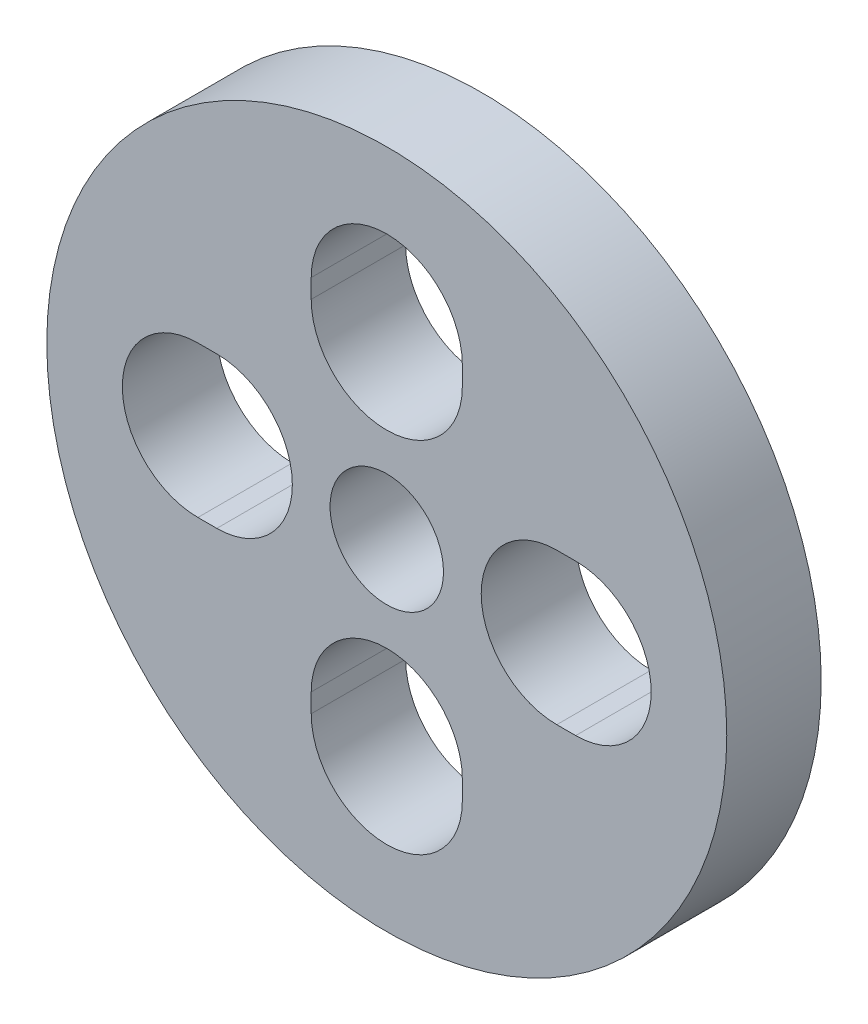
ISO-10303-21;
HEADER;
FILE_DESCRIPTION(('STEP AP214'),'2;1');
FILE_NAME('part.step','',(''),(''),'','','');
FILE_SCHEMA(('AUTOMOTIVE_DESIGN { 1 0 10303 214 1 1 1 1 }'));
ENDSEC;
DATA;
#1=APPLICATION_CONTEXT('core data for automotive mechanical design processes');
#2=APPLICATION_PROTOCOL_DEFINITION('international standard','automotive_design',2000,#1);
#3=PRODUCT_CONTEXT('',#1,'mechanical');
#4=PRODUCT('Part','Part','',(#3));
#5=PRODUCT_RELATED_PRODUCT_CATEGORY('part','',(#4));
#6=PRODUCT_DEFINITION_FORMATION('','',#4);
#7=PRODUCT_DEFINITION_CONTEXT('part definition',#1,'design');
#8=PRODUCT_DEFINITION('design','',#6,#7);
#9=PRODUCT_DEFINITION_SHAPE('','',#8);
#10=(LENGTH_UNIT() NAMED_UNIT(*) SI_UNIT(.MILLI.,.METRE.));
#11=(NAMED_UNIT(*) PLANE_ANGLE_UNIT() SI_UNIT($,.RADIAN.));
#12=(NAMED_UNIT(*) SI_UNIT($,.STERADIAN.) SOLID_ANGLE_UNIT());
#13=UNCERTAINTY_MEASURE_WITH_UNIT(LENGTH_MEASURE(1.E-05),#10,'distance_accuracy_value','');
#14=(GEOMETRIC_REPRESENTATION_CONTEXT(3) GLOBAL_UNCERTAINTY_ASSIGNED_CONTEXT((#13)) GLOBAL_UNIT_ASSIGNED_CONTEXT((#10,
#11,#12)) REPRESENTATION_CONTEXT('',''));
#15=CARTESIAN_POINT('',(0.,0.,0.));
#16=DIRECTION('',(0.,0.,1.));
#17=DIRECTION('',(1.,0.,0.));
#18=AXIS2_PLACEMENT_3D('',#15,#16,#17);
#19=CARTESIAN_POINT('',(0.,0.,5.));
#20=DIRECTION('',(0.,0.,1.));
#21=DIRECTION('',(1.,0.,0.));
#22=AXIS2_PLACEMENT_3D('',#19,#20,#21);
#23=PLANE('',#22);
#24=DIRECTION('',(-1.,0.,0.));
#25=VECTOR('',#24,1.);
#26=CARTESIAN_POINT('',(0.,3.99999999999995,5.));
#27=LINE('',#26,#25);
#28=CARTESIAN_POINT('',(9.99999999999994,3.99999999999995,5.));
#29=VERTEX_POINT('',#28);
#30=CARTESIAN_POINT('',(8.99999999999994,3.99999999999995,5.));
#31=VERTEX_POINT('',#30);
#32=EDGE_CURVE('E49',#29,#31,#27,.T.);
#33=ORIENTED_EDGE('',*,*,#32,.F.);
#34=CARTESIAN_POINT('',(9.99999999999994,0.,5.));
#35=DIRECTION('',(0.,0.,1.));
#36=DIRECTION('',(1.,0.,0.));
#37=AXIS2_PLACEMENT_3D('',#34,#35,#36);
#38=CIRCLE('',#37,4.);
#39=CARTESIAN_POINT('',(9.99999999999995,-4.00000000000005,5.));
#40=VERTEX_POINT('',#39);
#41=EDGE_CURVE('E164',#40,#29,#38,.T.);
#42=ORIENTED_EDGE('',*,*,#41,.F.);
#43=DIRECTION('',(-1.,0.,0.));
#44=VECTOR('',#43,1.);
#45=CARTESIAN_POINT('',(0.,-4.00000000000005,5.));
#46=LINE('',#45,#44);
#47=CARTESIAN_POINT('',(8.99999999999995,-4.00000000000005,5.));
#48=VERTEX_POINT('',#47);
#49=EDGE_CURVE('E167',#40,#48,#46,.T.);
#50=ORIENTED_EDGE('',*,*,#49,.T.);
#51=CARTESIAN_POINT('',(8.99999999999995,0.,5.));
#52=DIRECTION('',(0.,0.,1.));
#53=DIRECTION('',(1.,0.,0.));
#54=AXIS2_PLACEMENT_3D('',#51,#52,#53);
#55=CIRCLE('',#54,4.);
#56=EDGE_CURVE('E173',#31,#48,#55,.T.);
#57=ORIENTED_EDGE('',*,*,#56,.F.);
#58=EDGE_LOOP('',(#33,#42,#50,#57));
#59=FACE_BOUND('',#58,.T.);
#60=DIRECTION('',(0.,1.,0.));
#61=VECTOR('',#60,1.);
#62=CARTESIAN_POINT('',(3.99999999999989,0.,5.));
#63=LINE('',#62,#61);
#64=CARTESIAN_POINT('',(3.99999999999989,-10.,5.));
#65=VERTEX_POINT('',#64);
#66=CARTESIAN_POINT('',(3.99999999999989,-9.,5.));
#67=VERTEX_POINT('',#66);
#68=EDGE_CURVE('E179',#65,#67,#63,.T.);
#69=ORIENTED_EDGE('',*,*,#68,.F.);
#70=CARTESIAN_POINT('',(-1.06353585268578E-13,-10.,5.));
#71=DIRECTION('',(0.,0.,1.));
#72=DIRECTION('',(1.,0.,0.));
#73=AXIS2_PLACEMENT_3D('',#70,#71,#72);
#74=CIRCLE('',#73,4.);
#75=CARTESIAN_POINT('',(-4.00000000000011,-10.,5.));
#76=VERTEX_POINT('',#75);
#77=EDGE_CURVE('E187',#76,#65,#74,.T.);
#78=ORIENTED_EDGE('',*,*,#77,.F.);
#79=DIRECTION('',(0.,1.,0.));
#80=VECTOR('',#79,1.);
#81=CARTESIAN_POINT('',(-4.00000000000011,0.,5.));
#82=LINE('',#81,#80);
#83=CARTESIAN_POINT('',(-4.00000000000011,-9.,5.));
#84=VERTEX_POINT('',#83);
#85=EDGE_CURVE('E201',#76,#84,#82,.T.);
#86=ORIENTED_EDGE('',*,*,#85,.T.);
#87=CARTESIAN_POINT('',(-1.06333367311408E-13,-9.,5.));
#88=DIRECTION('',(0.,0.,1.));
#89=DIRECTION('',(1.,0.,0.));
#90=AXIS2_PLACEMENT_3D('',#87,#88,#89);
#91=CIRCLE('',#90,4.);
#92=EDGE_CURVE('E198',#67,#84,#91,.T.);
#93=ORIENTED_EDGE('',*,*,#92,.F.);
#94=EDGE_LOOP('',(#69,#78,#86,#93));
#95=FACE_BOUND('',#94,.T.);
#96=DIRECTION('',(1.,0.,0.));
#97=VECTOR('',#96,1.);
#98=CARTESIAN_POINT('',(0.,-3.99999999999994,5.));
#99=LINE('',#98,#97);
#100=CARTESIAN_POINT('',(-10.0000000000001,-3.99999999999994,5.));
#101=VERTEX_POINT('',#100);
#102=CARTESIAN_POINT('',(-9.00000000000006,-3.99999999999994,5.));
#103=VERTEX_POINT('',#102);
#104=EDGE_CURVE('E208',#101,#103,#99,.T.);
#105=ORIENTED_EDGE('',*,*,#104,.F.);
#106=CARTESIAN_POINT('',(-10.0000000000001,0.,5.));
#107=DIRECTION('',(0.,0.,1.));
#108=DIRECTION('',(1.,0.,0.));
#109=AXIS2_PLACEMENT_3D('',#106,#107,#108);
#110=CIRCLE('',#109,4.);
#111=CARTESIAN_POINT('',(-10.0000000000001,4.00000000000006,5.));
#112=VERTEX_POINT('',#111);
#113=EDGE_CURVE('E219',#112,#101,#110,.T.);
#114=ORIENTED_EDGE('',*,*,#113,.F.);
#115=DIRECTION('',(1.,0.,0.));
#116=VECTOR('',#115,1.);
#117=CARTESIAN_POINT('',(0.,4.00000000000006,5.));
#118=LINE('',#117,#116);
#119=CARTESIAN_POINT('',(-9.00000000000006,4.00000000000006,5.));
#120=VERTEX_POINT('',#119);
#121=EDGE_CURVE('E233',#112,#120,#118,.T.);
#122=ORIENTED_EDGE('',*,*,#121,.T.);
#123=CARTESIAN_POINT('',(-9.00000000000006,0.,5.));
#124=DIRECTION('',(0.,0.,1.));
#125=DIRECTION('',(1.,0.,0.));
#126=AXIS2_PLACEMENT_3D('',#123,#124,#125);
#127=CIRCLE('',#126,4.);
#128=EDGE_CURVE('E230',#103,#120,#127,.T.);
#129=ORIENTED_EDGE('',*,*,#128,.F.);
#130=EDGE_LOOP('',(#105,#114,#122,#129));
#131=FACE_BOUND('',#130,.T.);
#132=DIRECTION('',(0.,-1.,0.));
#133=VECTOR('',#132,1.);
#134=CARTESIAN_POINT('',(-4.,0.,5.));
#135=LINE('',#134,#133);
#136=CARTESIAN_POINT('',(-4.,10.,5.));
#137=VERTEX_POINT('',#136);
#138=CARTESIAN_POINT('',(-4.,9.,5.));
#139=VERTEX_POINT('',#138);
#140=EDGE_CURVE('E240',#137,#139,#135,.T.);
#141=ORIENTED_EDGE('',*,*,#140,.F.);
#142=CARTESIAN_POINT('',(0.,10.,5.));
#143=DIRECTION('',(0.,0.,1.));
#144=DIRECTION('',(1.,0.,0.));
#145=AXIS2_PLACEMENT_3D('',#142,#143,#144);
#146=CIRCLE('',#145,4.);
#147=CARTESIAN_POINT('',(4.,10.,5.));
#148=VERTEX_POINT('',#147);
#149=EDGE_CURVE('E251',#148,#137,#146,.T.);
#150=ORIENTED_EDGE('',*,*,#149,.F.);
#151=DIRECTION('',(0.,-1.,0.));
#152=VECTOR('',#151,1.);
#153=CARTESIAN_POINT('',(4.,0.,5.));
#154=LINE('',#153,#152);
#155=CARTESIAN_POINT('',(4.,9.,5.));
#156=VERTEX_POINT('',#155);
#157=EDGE_CURVE('E265',#148,#156,#154,.T.);
#158=ORIENTED_EDGE('',*,*,#157,.T.);
#159=CARTESIAN_POINT('',(0.,9.,5.));
#160=DIRECTION('',(0.,0.,1.));
#161=DIRECTION('',(1.,0.,0.));
#162=AXIS2_PLACEMENT_3D('',#159,#160,#161);
#163=CIRCLE('',#162,4.);
#164=EDGE_CURVE('E262',#139,#156,#163,.T.);
#165=ORIENTED_EDGE('',*,*,#164,.F.);
#166=EDGE_LOOP('',(#141,#150,#158,#165));
#167=FACE_BOUND('',#166,.T.);
#168=CARTESIAN_POINT('',(0.,0.,5.));
#169=DIRECTION('',(0.,0.,1.));
#170=DIRECTION('',(1.,0.,0.));
#171=AXIS2_PLACEMENT_3D('',#168,#169,#170);
#172=CIRCLE('',#171,18.);
#173=CARTESIAN_POINT('',(18.,0.,5.));
#174=VERTEX_POINT('',#173);
#175=EDGE_CURVE('E11',#174,#174,#172,.T.);
#176=ORIENTED_EDGE('',*,*,#175,.T.);
#177=EDGE_LOOP('',(#176));
#178=FACE_BOUND('',#177,.T.);
#179=CARTESIAN_POINT('',(0.,0.,5.));
#180=DIRECTION('',(0.,0.,1.));
#181=DIRECTION('',(1.,0.,0.));
#182=AXIS2_PLACEMENT_3D('',#179,#180,#181);
#183=CIRCLE('',#182,3.0025);
#184=CARTESIAN_POINT('',(3.0025,0.,5.));
#185=VERTEX_POINT('',#184);
#186=EDGE_CURVE('E279',#185,#185,#183,.T.);
#187=ORIENTED_EDGE('',*,*,#186,.F.);
#188=EDGE_LOOP('',(#187));
#189=FACE_BOUND('',#188,.T.);
#190=ADVANCED_FACE('F34',(#59,#95,#131,#167,#178,#189),#23,.T.);
#191=CARTESIAN_POINT('',(0.,0.,0.));
#192=DIRECTION('',(0.,0.,1.));
#193=DIRECTION('',(1.,0.,0.));
#194=AXIS2_PLACEMENT_3D('',#191,#192,#193);
#195=PLANE('',#194);
#196=CARTESIAN_POINT('',(9.99999999999994,0.,0.));
#197=DIRECTION('',(0.,0.,1.));
#198=DIRECTION('',(1.,0.,0.));
#199=AXIS2_PLACEMENT_3D('',#196,#197,#198);
#200=CIRCLE('',#199,4.);
#201=CARTESIAN_POINT('',(9.99999999999995,-4.00000000000005,0.));
#202=VERTEX_POINT('',#201);
#203=CARTESIAN_POINT('',(9.99999999999994,3.99999999999995,0.));
#204=VERTEX_POINT('',#203);
#205=EDGE_CURVE('E152',#202,#204,#200,.T.);
#206=ORIENTED_EDGE('',*,*,#205,.T.);
#207=DIRECTION('',(-1.,0.,0.));
#208=VECTOR('',#207,1.);
#209=CARTESIAN_POINT('',(0.,3.99999999999995,0.));
#210=LINE('',#209,#208);
#211=CARTESIAN_POINT('',(8.99999999999994,3.99999999999995,0.));
#212=VERTEX_POINT('',#211);
#213=EDGE_CURVE('E149',#204,#212,#210,.T.);
#214=ORIENTED_EDGE('',*,*,#213,.T.);
#215=CARTESIAN_POINT('',(8.99999999999995,0.,0.));
#216=DIRECTION('',(0.,0.,1.));
#217=DIRECTION('',(1.,0.,0.));
#218=AXIS2_PLACEMENT_3D('',#215,#216,#217);
#219=CIRCLE('',#218,4.);
#220=CARTESIAN_POINT('',(8.99999999999995,-4.00000000000005,0.));
#221=VERTEX_POINT('',#220);
#222=EDGE_CURVE('E155',#212,#221,#219,.T.);
#223=ORIENTED_EDGE('',*,*,#222,.T.);
#224=DIRECTION('',(-1.,0.,0.));
#225=VECTOR('',#224,1.);
#226=CARTESIAN_POINT('',(0.,-4.00000000000005,0.));
#227=LINE('',#226,#225);
#228=EDGE_CURVE('E159',#202,#221,#227,.T.);
#229=ORIENTED_EDGE('',*,*,#228,.F.);
#230=EDGE_LOOP('',(#206,#214,#223,#229));
#231=FACE_BOUND('',#230,.T.);
#232=CARTESIAN_POINT('',(-1.06353585268578E-13,-10.,0.));
#233=DIRECTION('',(0.,0.,1.));
#234=DIRECTION('',(1.,0.,0.));
#235=AXIS2_PLACEMENT_3D('',#232,#233,#234);
#236=CIRCLE('',#235,4.);
#237=CARTESIAN_POINT('',(-4.00000000000011,-10.,0.));
#238=VERTEX_POINT('',#237);
#239=CARTESIAN_POINT('',(3.99999999999989,-10.,0.));
#240=VERTEX_POINT('',#239);
#241=EDGE_CURVE('E193',#238,#240,#236,.T.);
#242=ORIENTED_EDGE('',*,*,#241,.T.);
#243=DIRECTION('',(0.,1.,0.));
#244=VECTOR('',#243,1.);
#245=CARTESIAN_POINT('',(3.99999999999989,0.,0.));
#246=LINE('',#245,#244);
#247=CARTESIAN_POINT('',(3.99999999999989,-9.,0.));
#248=VERTEX_POINT('',#247);
#249=EDGE_CURVE('E183',#240,#248,#246,.T.);
#250=ORIENTED_EDGE('',*,*,#249,.T.);
#251=CARTESIAN_POINT('',(-1.06333367311408E-13,-9.,0.));
#252=DIRECTION('',(0.,0.,1.));
#253=DIRECTION('',(1.,0.,0.));
#254=AXIS2_PLACEMENT_3D('',#251,#252,#253);
#255=CIRCLE('',#254,4.);
#256=CARTESIAN_POINT('',(-4.00000000000011,-9.,0.));
#257=VERTEX_POINT('',#256);
#258=EDGE_CURVE('E186',#248,#257,#255,.T.);
#259=ORIENTED_EDGE('',*,*,#258,.T.);
#260=DIRECTION('',(0.,1.,0.));
#261=VECTOR('',#260,1.);
#262=CARTESIAN_POINT('',(-4.00000000000011,0.,0.));
#263=LINE('',#262,#261);
#264=EDGE_CURVE('E190',#238,#257,#263,.T.);
#265=ORIENTED_EDGE('',*,*,#264,.F.);
#266=EDGE_LOOP('',(#242,#250,#259,#265));
#267=FACE_BOUND('',#266,.T.);
#268=CARTESIAN_POINT('',(-10.0000000000001,0.,0.));
#269=DIRECTION('',(0.,0.,1.));
#270=DIRECTION('',(1.,0.,0.));
#271=AXIS2_PLACEMENT_3D('',#268,#269,#270);
#272=CIRCLE('',#271,4.);
#273=CARTESIAN_POINT('',(-10.0000000000001,4.00000000000006,0.));
#274=VERTEX_POINT('',#273);
#275=CARTESIAN_POINT('',(-10.0000000000001,-3.99999999999994,0.));
#276=VERTEX_POINT('',#275);
#277=EDGE_CURVE('E225',#274,#276,#272,.T.);
#278=ORIENTED_EDGE('',*,*,#277,.T.);
#279=DIRECTION('',(1.,0.,0.));
#280=VECTOR('',#279,1.);
#281=CARTESIAN_POINT('',(0.,-3.99999999999994,0.));
#282=LINE('',#281,#280);
#283=CARTESIAN_POINT('',(-9.00000000000006,-3.99999999999994,0.));
#284=VERTEX_POINT('',#283);
#285=EDGE_CURVE('E215',#276,#284,#282,.T.);
#286=ORIENTED_EDGE('',*,*,#285,.T.);
#287=CARTESIAN_POINT('',(-9.00000000000006,0.,0.));
#288=DIRECTION('',(0.,0.,1.));
#289=DIRECTION('',(1.,0.,0.));
#290=AXIS2_PLACEMENT_3D('',#287,#288,#289);
#291=CIRCLE('',#290,4.);
#292=CARTESIAN_POINT('',(-9.00000000000006,4.00000000000005,0.));
#293=VERTEX_POINT('',#292);
#294=EDGE_CURVE('E218',#284,#293,#291,.T.);
#295=ORIENTED_EDGE('',*,*,#294,.T.);
#296=DIRECTION('',(1.,0.,0.));
#297=VECTOR('',#296,1.);
#298=CARTESIAN_POINT('',(0.,4.00000000000006,0.));
#299=LINE('',#298,#297);
#300=EDGE_CURVE('E222',#274,#293,#299,.T.);
#301=ORIENTED_EDGE('',*,*,#300,.F.);
#302=EDGE_LOOP('',(#278,#286,#295,#301));
#303=FACE_BOUND('',#302,.T.);
#304=CARTESIAN_POINT('',(0.,10.,0.));
#305=DIRECTION('',(0.,0.,1.));
#306=DIRECTION('',(1.,0.,0.));
#307=AXIS2_PLACEMENT_3D('',#304,#305,#306);
#308=CIRCLE('',#307,4.);
#309=CARTESIAN_POINT('',(4.,10.,0.));
#310=VERTEX_POINT('',#309);
#311=CARTESIAN_POINT('',(-4.,10.,0.));
#312=VERTEX_POINT('',#311);
#313=EDGE_CURVE('E257',#310,#312,#308,.T.);
#314=ORIENTED_EDGE('',*,*,#313,.T.);
#315=DIRECTION('',(0.,-1.,0.));
#316=VECTOR('',#315,1.);
#317=CARTESIAN_POINT('',(-4.,0.,0.));
#318=LINE('',#317,#316);
#319=CARTESIAN_POINT('',(-4.,9.,0.));
#320=VERTEX_POINT('',#319);
#321=EDGE_CURVE('E247',#312,#320,#318,.T.);
#322=ORIENTED_EDGE('',*,*,#321,.T.);
#323=CARTESIAN_POINT('',(0.,9.,0.));
#324=DIRECTION('',(0.,0.,1.));
#325=DIRECTION('',(1.,0.,0.));
#326=AXIS2_PLACEMENT_3D('',#323,#324,#325);
#327=CIRCLE('',#326,4.);
#328=CARTESIAN_POINT('',(4.,9.,0.));
#329=VERTEX_POINT('',#328);
#330=EDGE_CURVE('E250',#320,#329,#327,.T.);
#331=ORIENTED_EDGE('',*,*,#330,.T.);
#332=DIRECTION('',(0.,-1.,0.));
#333=VECTOR('',#332,1.);
#334=CARTESIAN_POINT('',(4.,0.,0.));
#335=LINE('',#334,#333);
#336=EDGE_CURVE('E254',#310,#329,#335,.T.);
#337=ORIENTED_EDGE('',*,*,#336,.F.);
#338=EDGE_LOOP('',(#314,#322,#331,#337));
#339=FACE_BOUND('',#338,.T.);
#340=CARTESIAN_POINT('',(0.,0.,0.));
#341=DIRECTION('',(0.,0.,1.));
#342=DIRECTION('',(1.,0.,0.));
#343=AXIS2_PLACEMENT_3D('',#340,#341,#342);
#344=CIRCLE('',#343,18.);
#345=CARTESIAN_POINT('',(18.,0.,0.));
#346=VERTEX_POINT('',#345);
#347=EDGE_CURVE('E38',#346,#346,#344,.T.);
#348=ORIENTED_EDGE('',*,*,#347,.F.);
#349=EDGE_LOOP('',(#348));
#350=FACE_BOUND('',#349,.T.);
#351=CARTESIAN_POINT('',(0.,0.,0.));
#352=DIRECTION('',(0.,0.,1.));
#353=DIRECTION('',(1.,0.,0.));
#354=AXIS2_PLACEMENT_3D('',#351,#352,#353);
#355=CIRCLE('',#354,3.0025);
#356=CARTESIAN_POINT('',(3.0025,0.,0.));
#357=VERTEX_POINT('',#356);
#358=EDGE_CURVE('E272',#357,#357,#355,.T.);
#359=ORIENTED_EDGE('',*,*,#358,.T.);
#360=EDGE_LOOP('',(#359));
#361=FACE_BOUND('',#360,.T.);
#362=ADVANCED_FACE('F161',(#231,#267,#303,#339,#350,#361),#195,.F.);
#363=CARTESIAN_POINT('',(0.,0.,5.));
#364=DIRECTION('',(0.,0.,-1.));
#365=DIRECTION('',(-1.,0.,0.));
#366=AXIS2_PLACEMENT_3D('',#363,#364,#365);
#367=CYLINDRICAL_SURFACE('',#366,18.);
#368=ORIENTED_EDGE('',*,*,#175,.F.);
#369=EDGE_LOOP('',(#368));
#370=FACE_BOUND('',#369,.T.);
#371=ORIENTED_EDGE('',*,*,#347,.T.);
#372=EDGE_LOOP('',(#371));
#373=FACE_BOUND('',#372,.T.);
#374=ADVANCED_FACE('F36',(#370,#373),#367,.T.);
#375=CARTESIAN_POINT('',(0.,0.,5.));
#376=DIRECTION('',(0.,0.,-1.));
#377=DIRECTION('',(-1.,0.,0.));
#378=AXIS2_PLACEMENT_3D('',#375,#376,#377);
#379=CYLINDRICAL_SURFACE('',#378,3.0025);
#380=ORIENTED_EDGE('',*,*,#186,.T.);
#381=EDGE_LOOP('',(#380));
#382=FACE_BOUND('',#381,.T.);
#383=ORIENTED_EDGE('',*,*,#358,.F.);
#384=EDGE_LOOP('',(#383));
#385=FACE_BOUND('',#384,.T.);
#386=ADVANCED_FACE('F286',(#382,#385),#379,.F.);
#387=CARTESIAN_POINT('',(-4.,0.,0.));
#388=DIRECTION('',(-1.,0.,0.));
#389=DIRECTION('',(0.,0.,1.));
#390=AXIS2_PLACEMENT_3D('',#387,#388,#389);
#391=PLANE('',#390);
#392=ORIENTED_EDGE('',*,*,#140,.T.);
#393=DIRECTION('',(0.,0.,1.));
#394=VECTOR('',#393,1.);
#395=CARTESIAN_POINT('',(-4.,9.,0.));
#396=LINE('',#395,#394);
#397=EDGE_CURVE('E260',#320,#139,#396,.T.);
#398=ORIENTED_EDGE('',*,*,#397,.F.);
#399=ORIENTED_EDGE('',*,*,#321,.F.);
#400=DIRECTION('',(0.,0.,1.));
#401=VECTOR('',#400,1.);
#402=CARTESIAN_POINT('',(-4.,10.,0.));
#403=LINE('',#402,#401);
#404=EDGE_CURVE('E270',#312,#137,#403,.T.);
#405=ORIENTED_EDGE('',*,*,#404,.T.);
#406=EDGE_LOOP('',(#392,#398,#399,#405));
#407=FACE_BOUND('',#406,.T.);
#408=ADVANCED_FACE('F288',(#407),#391,.F.);
#409=CARTESIAN_POINT('',(0.,10.,0.));
#410=DIRECTION('',(0.,0.,1.));
#411=DIRECTION('',(1.,0.,0.));
#412=AXIS2_PLACEMENT_3D('',#409,#410,#411);
#413=CYLINDRICAL_SURFACE('',#412,4.);
#414=ORIENTED_EDGE('',*,*,#149,.T.);
#415=ORIENTED_EDGE('',*,*,#404,.F.);
#416=ORIENTED_EDGE('',*,*,#313,.F.);
#417=DIRECTION('',(0.,0.,1.));
#418=VECTOR('',#417,1.);
#419=CARTESIAN_POINT('',(4.,10.,0.));
#420=LINE('',#419,#418);
#421=EDGE_CURVE('E273',#310,#148,#420,.T.);
#422=ORIENTED_EDGE('',*,*,#421,.T.);
#423=EDGE_LOOP('',(#414,#415,#416,#422));
#424=FACE_BOUND('',#423,.T.);
#425=ADVANCED_FACE('F295',(#424),#413,.F.);
#426=CARTESIAN_POINT('',(4.,0.,0.));
#427=DIRECTION('',(-1.,0.,0.));
#428=DIRECTION('',(0.,0.,1.));
#429=AXIS2_PLACEMENT_3D('',#426,#427,#428);
#430=PLANE('',#429);
#431=ORIENTED_EDGE('',*,*,#157,.F.);
#432=ORIENTED_EDGE('',*,*,#421,.F.);
#433=ORIENTED_EDGE('',*,*,#336,.T.);
#434=DIRECTION('',(0.,0.,1.));
#435=VECTOR('',#434,1.);
#436=CARTESIAN_POINT('',(4.,9.,0.));
#437=LINE('',#436,#435);
#438=EDGE_CURVE('E275',#329,#156,#437,.T.);
#439=ORIENTED_EDGE('',*,*,#438,.T.);
#440=EDGE_LOOP('',(#431,#432,#433,#439));
#441=FACE_BOUND('',#440,.T.);
#442=ADVANCED_FACE('F336',(#441),#430,.T.);
#443=CARTESIAN_POINT('',(0.,9.,0.));
#444=DIRECTION('',(0.,0.,1.));
#445=DIRECTION('',(1.,0.,0.));
#446=AXIS2_PLACEMENT_3D('',#443,#444,#445);
#447=CYLINDRICAL_SURFACE('',#446,4.);
#448=ORIENTED_EDGE('',*,*,#164,.T.);
#449=ORIENTED_EDGE('',*,*,#438,.F.);
#450=ORIENTED_EDGE('',*,*,#330,.F.);
#451=ORIENTED_EDGE('',*,*,#397,.T.);
#452=EDGE_LOOP('',(#448,#449,#450,#451));
#453=FACE_BOUND('',#452,.T.);
#454=ADVANCED_FACE('F329',(#453),#447,.F.);
#455=CARTESIAN_POINT('',(0.,-3.99999999999994,0.));
#456=DIRECTION('',(0.,-1.,0.));
#457=DIRECTION('',(0.,0.,-1.));
#458=AXIS2_PLACEMENT_3D('',#455,#456,#457);
#459=PLANE('',#458);
#460=ORIENTED_EDGE('',*,*,#104,.T.);
#461=DIRECTION('',(0.,0.,1.));
#462=VECTOR('',#461,1.);
#463=CARTESIAN_POINT('',(-9.00000000000006,-3.99999999999994,0.));
#464=LINE('',#463,#462);
#465=EDGE_CURVE('E228',#284,#103,#464,.T.);
#466=ORIENTED_EDGE('',*,*,#465,.F.);
#467=ORIENTED_EDGE('',*,*,#285,.F.);
#468=DIRECTION('',(0.,0.,1.));
#469=VECTOR('',#468,1.);
#470=CARTESIAN_POINT('',(-10.0000000000001,-3.99999999999994,0.));
#471=LINE('',#470,#469);
#472=EDGE_CURVE('E238',#276,#101,#471,.T.);
#473=ORIENTED_EDGE('',*,*,#472,.T.);
#474=EDGE_LOOP('',(#460,#466,#467,#473));
#475=FACE_BOUND('',#474,.T.);
#476=ADVANCED_FACE('F343',(#475),#459,.F.);
#477=CARTESIAN_POINT('',(-10.0000000000001,0.,0.));
#478=DIRECTION('',(0.,0.,1.));
#479=DIRECTION('',(1.,0.,0.));
#480=AXIS2_PLACEMENT_3D('',#477,#478,#479);
#481=CYLINDRICAL_SURFACE('',#480,4.);
#482=ORIENTED_EDGE('',*,*,#113,.T.);
#483=ORIENTED_EDGE('',*,*,#472,.F.);
#484=ORIENTED_EDGE('',*,*,#277,.F.);
#485=DIRECTION('',(0.,0.,1.));
#486=VECTOR('',#485,1.);
#487=CARTESIAN_POINT('',(-10.0000000000001,4.00000000000006,0.));
#488=LINE('',#487,#486);
#489=EDGE_CURVE('E241',#274,#112,#488,.T.);
#490=ORIENTED_EDGE('',*,*,#489,.T.);
#491=EDGE_LOOP('',(#482,#483,#484,#490));
#492=FACE_BOUND('',#491,.T.);
#493=ADVANCED_FACE('F349',(#492),#481,.F.);
#494=CARTESIAN_POINT('',(0.,4.00000000000006,0.));
#495=DIRECTION('',(0.,-1.,0.));
#496=DIRECTION('',(0.,0.,-1.));
#497=AXIS2_PLACEMENT_3D('',#494,#495,#496);
#498=PLANE('',#497);
#499=ORIENTED_EDGE('',*,*,#121,.F.);
#500=ORIENTED_EDGE('',*,*,#489,.F.);
#501=ORIENTED_EDGE('',*,*,#300,.T.);
#502=DIRECTION('',(0.,0.,1.));
#503=VECTOR('',#502,1.);
#504=CARTESIAN_POINT('',(-9.00000000000006,4.00000000000006,0.));
#505=LINE('',#504,#503);
#506=EDGE_CURVE('E243',#293,#120,#505,.T.);
#507=ORIENTED_EDGE('',*,*,#506,.T.);
#508=EDGE_LOOP('',(#499,#500,#501,#507));
#509=FACE_BOUND('',#508,.T.);
#510=ADVANCED_FACE('F355',(#509),#498,.T.);
#511=CARTESIAN_POINT('',(-9.00000000000006,0.,0.));
#512=DIRECTION('',(0.,0.,1.));
#513=DIRECTION('',(1.,0.,0.));
#514=AXIS2_PLACEMENT_3D('',#511,#512,#513);
#515=CYLINDRICAL_SURFACE('',#514,4.);
#516=ORIENTED_EDGE('',*,*,#128,.T.);
#517=ORIENTED_EDGE('',*,*,#506,.F.);
#518=ORIENTED_EDGE('',*,*,#294,.F.);
#519=ORIENTED_EDGE('',*,*,#465,.T.);
#520=EDGE_LOOP('',(#516,#517,#518,#519));
#521=FACE_BOUND('',#520,.T.);
#522=ADVANCED_FACE('F351',(#521),#515,.F.);
#523=CARTESIAN_POINT('',(3.99999999999989,0.,0.));
#524=DIRECTION('',(1.,0.,0.));
#525=DIRECTION('',(0.,0.,-1.));
#526=AXIS2_PLACEMENT_3D('',#523,#524,#525);
#527=PLANE('',#526);
#528=ORIENTED_EDGE('',*,*,#68,.T.);
#529=DIRECTION('',(0.,0.,1.));
#530=VECTOR('',#529,1.);
#531=CARTESIAN_POINT('',(3.99999999999989,-9.,0.));
#532=LINE('',#531,#530);
#533=EDGE_CURVE('E196',#248,#67,#532,.T.);
#534=ORIENTED_EDGE('',*,*,#533,.F.);
#535=ORIENTED_EDGE('',*,*,#249,.F.);
#536=DIRECTION('',(0.,0.,1.));
#537=VECTOR('',#536,1.);
#538=CARTESIAN_POINT('',(3.99999999999989,-10.,0.));
#539=LINE('',#538,#537);
#540=EDGE_CURVE('E206',#240,#65,#539,.T.);
#541=ORIENTED_EDGE('',*,*,#540,.T.);
#542=EDGE_LOOP('',(#528,#534,#535,#541));
#543=FACE_BOUND('',#542,.T.);
#544=ADVANCED_FACE('F354',(#543),#527,.F.);
#545=CARTESIAN_POINT('',(-1.06353585268578E-13,-10.,0.));
#546=DIRECTION('',(0.,0.,1.));
#547=DIRECTION('',(1.,0.,0.));
#548=AXIS2_PLACEMENT_3D('',#545,#546,#547);
#549=CYLINDRICAL_SURFACE('',#548,4.);
#550=ORIENTED_EDGE('',*,*,#77,.T.);
#551=ORIENTED_EDGE('',*,*,#540,.F.);
#552=ORIENTED_EDGE('',*,*,#241,.F.);
#553=DIRECTION('',(0.,0.,1.));
#554=VECTOR('',#553,1.);
#555=CARTESIAN_POINT('',(-4.00000000000011,-10.,0.));
#556=LINE('',#555,#554);
#557=EDGE_CURVE('E209',#238,#76,#556,.T.);
#558=ORIENTED_EDGE('',*,*,#557,.T.);
#559=EDGE_LOOP('',(#550,#551,#552,#558));
#560=FACE_BOUND('',#559,.T.);
#561=ADVANCED_FACE('F365',(#560),#549,.F.);
#562=CARTESIAN_POINT('',(-4.00000000000011,0.,0.));
#563=DIRECTION('',(1.,0.,0.));
#564=DIRECTION('',(0.,0.,-1.));
#565=AXIS2_PLACEMENT_3D('',#562,#563,#564);
#566=PLANE('',#565);
#567=ORIENTED_EDGE('',*,*,#85,.F.);
#568=ORIENTED_EDGE('',*,*,#557,.F.);
#569=ORIENTED_EDGE('',*,*,#264,.T.);
#570=DIRECTION('',(0.,0.,1.));
#571=VECTOR('',#570,1.);
#572=CARTESIAN_POINT('',(-4.00000000000011,-9.,0.));
#573=LINE('',#572,#571);
#574=EDGE_CURVE('E211',#257,#84,#573,.T.);
#575=ORIENTED_EDGE('',*,*,#574,.T.);
#576=EDGE_LOOP('',(#567,#568,#569,#575));
#577=FACE_BOUND('',#576,.T.);
#578=ADVANCED_FACE('F370',(#577),#566,.T.);
#579=CARTESIAN_POINT('',(-1.06333367311408E-13,-9.,0.));
#580=DIRECTION('',(0.,0.,1.));
#581=DIRECTION('',(1.,0.,0.));
#582=AXIS2_PLACEMENT_3D('',#579,#580,#581);
#583=CYLINDRICAL_SURFACE('',#582,4.);
#584=ORIENTED_EDGE('',*,*,#92,.T.);
#585=ORIENTED_EDGE('',*,*,#574,.F.);
#586=ORIENTED_EDGE('',*,*,#258,.F.);
#587=ORIENTED_EDGE('',*,*,#533,.T.);
#588=EDGE_LOOP('',(#584,#585,#586,#587));
#589=FACE_BOUND('',#588,.T.);
#590=ADVANCED_FACE('F367',(#589),#583,.F.);
#591=CARTESIAN_POINT('',(0.,3.99999999999995,0.));
#592=DIRECTION('',(0.,1.,0.));
#593=DIRECTION('',(0.,0.,1.));
#594=AXIS2_PLACEMENT_3D('',#591,#592,#593);
#595=PLANE('',#594);
#596=ORIENTED_EDGE('',*,*,#32,.T.);
#597=DIRECTION('',(0.,0.,1.));
#598=VECTOR('',#597,1.);
#599=CARTESIAN_POINT('',(8.99999999999994,3.99999999999995,0.));
#600=LINE('',#599,#598);
#601=EDGE_CURVE('E146',#212,#31,#600,.T.);
#602=ORIENTED_EDGE('',*,*,#601,.F.);
#603=ORIENTED_EDGE('',*,*,#213,.F.);
#604=DIRECTION('',(0.,0.,1.));
#605=VECTOR('',#604,1.);
#606=CARTESIAN_POINT('',(9.99999999999994,3.99999999999995,0.));
#607=LINE('',#606,#605);
#608=EDGE_CURVE('E177',#204,#29,#607,.T.);
#609=ORIENTED_EDGE('',*,*,#608,.T.);
#610=EDGE_LOOP('',(#596,#602,#603,#609));
#611=FACE_BOUND('',#610,.T.);
#612=ADVANCED_FACE('F147',(#611),#595,.F.);
#613=CARTESIAN_POINT('',(9.99999999999994,0.,0.));
#614=DIRECTION('',(0.,0.,1.));
#615=DIRECTION('',(1.,0.,0.));
#616=AXIS2_PLACEMENT_3D('',#613,#614,#615);
#617=CYLINDRICAL_SURFACE('',#616,4.);
#618=ORIENTED_EDGE('',*,*,#41,.T.);
#619=ORIENTED_EDGE('',*,*,#608,.F.);
#620=ORIENTED_EDGE('',*,*,#205,.F.);
#621=DIRECTION('',(0.,0.,1.));
#622=VECTOR('',#621,1.);
#623=CARTESIAN_POINT('',(9.99999999999995,-4.00000000000005,0.));
#624=LINE('',#623,#622);
#625=EDGE_CURVE('E180',#202,#40,#624,.T.);
#626=ORIENTED_EDGE('',*,*,#625,.T.);
#627=EDGE_LOOP('',(#618,#619,#620,#626));
#628=FACE_BOUND('',#627,.T.);
#629=ADVANCED_FACE('F380',(#628),#617,.F.);
#630=CARTESIAN_POINT('',(0.,-4.00000000000005,0.));
#631=DIRECTION('',(0.,1.,0.));
#632=DIRECTION('',(0.,0.,1.));
#633=AXIS2_PLACEMENT_3D('',#630,#631,#632);
#634=PLANE('',#633);
#635=ORIENTED_EDGE('',*,*,#49,.F.);
#636=ORIENTED_EDGE('',*,*,#625,.F.);
#637=ORIENTED_EDGE('',*,*,#228,.T.);
#638=DIRECTION('',(0.,0.,1.));
#639=VECTOR('',#638,1.);
#640=CARTESIAN_POINT('',(8.99999999999995,-4.00000000000005,0.));
#641=LINE('',#640,#639);
#642=EDGE_CURVE('E57',#221,#48,#641,.T.);
#643=ORIENTED_EDGE('',*,*,#642,.T.);
#644=EDGE_LOOP('',(#635,#636,#637,#643));
#645=FACE_BOUND('',#644,.T.);
#646=ADVANCED_FACE('F383',(#645),#634,.T.);
#647=CARTESIAN_POINT('',(8.99999999999995,0.,0.));
#648=DIRECTION('',(0.,0.,1.));
#649=DIRECTION('',(1.,0.,0.));
#650=AXIS2_PLACEMENT_3D('',#647,#648,#649);
#651=CYLINDRICAL_SURFACE('',#650,4.);
#652=ORIENTED_EDGE('',*,*,#56,.T.);
#653=ORIENTED_EDGE('',*,*,#642,.F.);
#654=ORIENTED_EDGE('',*,*,#222,.F.);
#655=ORIENTED_EDGE('',*,*,#601,.T.);
#656=EDGE_LOOP('',(#652,#653,#654,#655));
#657=FACE_BOUND('',#656,.T.);
#658=ADVANCED_FACE('F156',(#657),#651,.F.);
#659=CLOSED_SHELL('',(#190,#362,#374,#386,#408,#425,#442,#454,#476,#493,#510,#522,#544,#561,
#578,#590,#612,#629,#646,#658));
#660=MANIFOLD_SOLID_BREP('B2',#659);
#661=ADVANCED_BREP_SHAPE_REPRESENTATION('',(#18,#660),#14);
#662=SHAPE_DEFINITION_REPRESENTATION(#9,#661);
ENDSEC;
END-ISO-10303-21;
